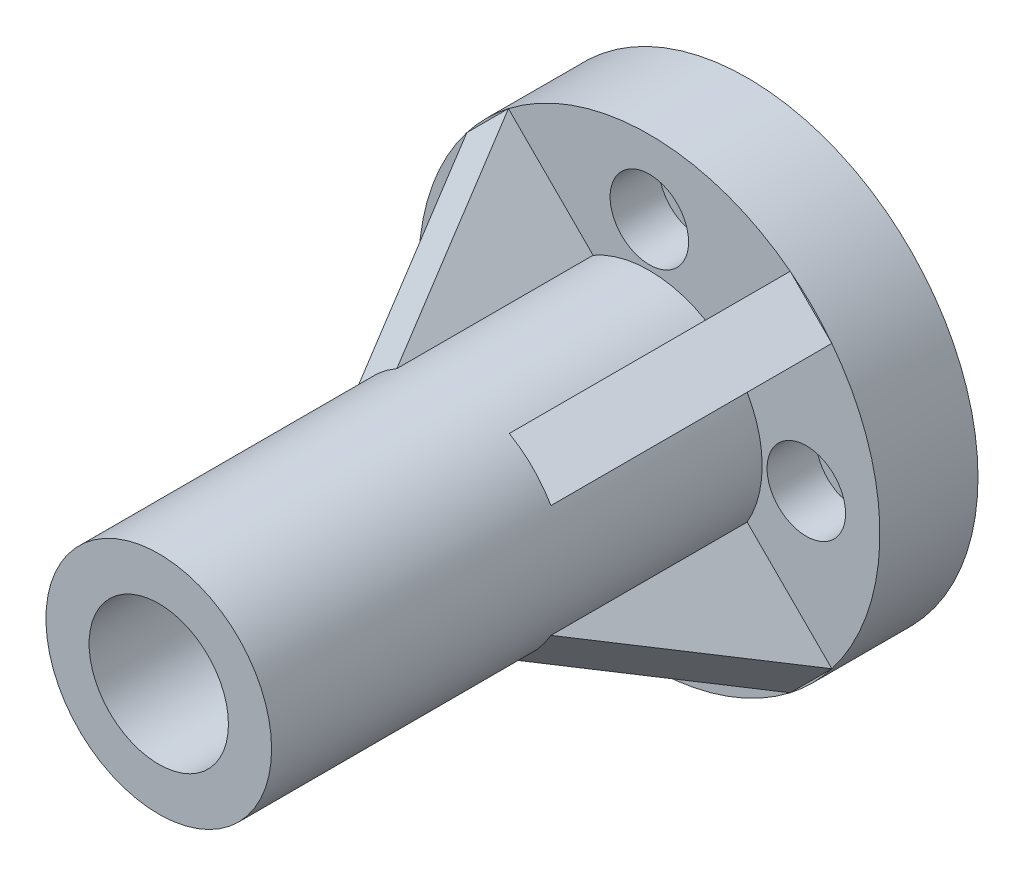
ISO-10303-21;
HEADER;
FILE_DESCRIPTION(('STEP AP214'),'2;1');
FILE_NAME('part.step','',(''),(''),'','','');
FILE_SCHEMA(('AUTOMOTIVE_DESIGN { 1 0 10303 214 1 1 1 1 }'));
ENDSEC;
DATA;
#1=APPLICATION_CONTEXT('core data for automotive mechanical design processes');
#2=APPLICATION_PROTOCOL_DEFINITION('international standard','automotive_design',2000,#1);
#3=PRODUCT_CONTEXT('',#1,'mechanical');
#4=PRODUCT('Part','Part','',(#3));
#5=PRODUCT_RELATED_PRODUCT_CATEGORY('part','',(#4));
#6=PRODUCT_DEFINITION_FORMATION('','',#4);
#7=PRODUCT_DEFINITION_CONTEXT('part definition',#1,'design');
#8=PRODUCT_DEFINITION('design','',#6,#7);
#9=PRODUCT_DEFINITION_SHAPE('','',#8);
#10=(LENGTH_UNIT() NAMED_UNIT(*) SI_UNIT(.MILLI.,.METRE.));
#11=(NAMED_UNIT(*) PLANE_ANGLE_UNIT() SI_UNIT($,.RADIAN.));
#12=(NAMED_UNIT(*) SI_UNIT($,.STERADIAN.) SOLID_ANGLE_UNIT());
#13=UNCERTAINTY_MEASURE_WITH_UNIT(LENGTH_MEASURE(1.E-05),#10,'distance_accuracy_value','');
#14=(GEOMETRIC_REPRESENTATION_CONTEXT(3) GLOBAL_UNCERTAINTY_ASSIGNED_CONTEXT((#13)) GLOBAL_UNIT_ASSIGNED_CONTEXT((#10,
#11,#12)) REPRESENTATION_CONTEXT('',''));
#15=CARTESIAN_POINT('',(0.,0.,0.));
#16=DIRECTION('',(0.,0.,1.));
#17=DIRECTION('',(1.,0.,0.));
#18=AXIS2_PLACEMENT_3D('',#15,#16,#17);
#19=CARTESIAN_POINT('',(0.,0.,5.));
#20=DIRECTION('',(0.,0.,1.));
#21=DIRECTION('',(1.,0.,0.));
#22=AXIS2_PLACEMENT_3D('',#19,#20,#21);
#23=PLANE('',#22);
#24=CARTESIAN_POINT('',(7.99998677689229,0.0145454305034583,5.));
#25=DIRECTION('',(0.,0.,1.));
#26=DIRECTION('',(1.,0.,0.));
#27=AXIS2_PLACEMENT_3D('',#24,#25,#26);
#28=CIRCLE('',#27,2.);
#29=CARTESIAN_POINT('',(9.99998677689229,0.0145454305034583,5.));
#30=VERTEX_POINT('',#29);
#31=EDGE_CURVE('E246',#30,#30,#28,.T.);
#32=ORIENTED_EDGE('',*,*,#31,.F.);
#33=EDGE_LOOP('',(#32));
#34=FACE_BOUND('',#33,.T.);
#35=CARTESIAN_POINT('',(0.,0.,5.));
#36=DIRECTION('',(0.,0.,1.));
#37=DIRECTION('',(1.,0.,0.));
#38=AXIS2_PLACEMENT_3D('',#35,#36,#37);
#39=CIRCLE('',#38,11.75);
#40=CARTESIAN_POINT('',(9.30118503370458,-7.17986469014493,5.));
#41=VERTEX_POINT('',#40);
#42=CARTESIAN_POINT('',(9.3011850337045,7.17986469014503,5.));
#43=VERTEX_POINT('',#42);
#44=EDGE_CURVE('E320',#41,#43,#39,.T.);
#45=ORIENTED_EDGE('',*,*,#44,.T.);
#46=DIRECTION('',(0.70710678118654,0.707106781186555,0.));
#47=VECTOR('',#46,1.);
#48=CARTESIAN_POINT('',(7.34288324568463,5.22156290212512,5.));
#49=LINE('',#48,#47);
#50=CARTESIAN_POINT('',(4.98573978880669,2.86441944524712,5.));
#51=VERTEX_POINT('',#50);
#52=EDGE_CURVE('E65',#51,#43,#49,.T.);
#53=ORIENTED_EDGE('',*,*,#52,.F.);
#54=CARTESIAN_POINT('',(0.,0.,5.));
#55=DIRECTION('',(0.,0.,1.));
#56=DIRECTION('',(1.,0.,0.));
#57=AXIS2_PLACEMENT_3D('',#54,#55,#56);
#58=CIRCLE('',#57,5.75);
#59=CARTESIAN_POINT('',(4.98573978880672,-2.86441944524707,5.));
#60=VERTEX_POINT('',#59);
#61=EDGE_CURVE('E405',#60,#51,#58,.T.);
#62=ORIENTED_EDGE('',*,*,#61,.F.);
#63=DIRECTION('',(-0.707106781186548,0.707106781186547,0.));
#64=VECTOR('',#63,1.);
#65=CARTESIAN_POINT('',(7.34288324568468,-5.22156290212504,5.));
#66=LINE('',#65,#64);
#67=EDGE_CURVE('E341',#41,#60,#66,.T.);
#68=ORIENTED_EDGE('',*,*,#67,.F.);
#69=EDGE_LOOP('',(#45,#53,#62,#68));
#70=FACE_BOUND('',#69,.T.);
#71=ADVANCED_FACE('F41',(#34,#70),#23,.T.);
#72=CARTESIAN_POINT('',(0.,8.,5.));
#73=DIRECTION('',(0.,0.,1.));
#74=DIRECTION('',(1.,0.,0.));
#75=AXIS2_PLACEMENT_3D('',#72,#73,#74);
#76=CIRCLE('',#75,2.);
#77=CARTESIAN_POINT('',(2.,8.,5.));
#78=VERTEX_POINT('',#77);
#79=EDGE_CURVE('E227',#78,#78,#76,.T.);
#80=ORIENTED_EDGE('',*,*,#79,.F.);
#81=EDGE_LOOP('',(#80));
#82=FACE_BOUND('',#81,.T.);
#83=CARTESIAN_POINT('',(2.86441944524702,4.98573978880675,5.));
#84=VERTEX_POINT('',#83);
#85=CARTESIAN_POINT('',(-2.86441944524707,4.98573978880672,5.));
#86=VERTEX_POINT('',#85);
#87=EDGE_CURVE('E218',#84,#86,#58,.T.);
#88=ORIENTED_EDGE('',*,*,#87,.F.);
#89=DIRECTION('',(-0.70710678118654,-0.707106781186555,0.));
#90=VECTOR('',#89,1.);
#91=CARTESIAN_POINT('',(5.22156290212496,7.34288324568474,5.));
#92=LINE('',#91,#90);
#93=CARTESIAN_POINT('',(7.17986469014484,9.30118503370465,5.));
#94=VERTEX_POINT('',#93);
#95=EDGE_CURVE('E394',#94,#84,#92,.T.);
#96=ORIENTED_EDGE('',*,*,#95,.F.);
#97=CARTESIAN_POINT('',(-7.17986469014494,9.30118503370458,5.));
#98=VERTEX_POINT('',#97);
#99=EDGE_CURVE('E301',#94,#98,#39,.T.);
#100=ORIENTED_EDGE('',*,*,#99,.T.);
#101=DIRECTION('',(-0.707106781186548,0.707106781186547,0.));
#102=VECTOR('',#101,1.);
#103=CARTESIAN_POINT('',(-5.22156290212504,7.34288324568468,5.));
#104=LINE('',#103,#102);
#105=EDGE_CURVE('E187',#86,#98,#104,.T.);
#106=ORIENTED_EDGE('',*,*,#105,.F.);
#107=EDGE_LOOP('',(#88,#96,#100,#106));
#108=FACE_BOUND('',#107,.T.);
#109=ADVANCED_FACE('F419',(#82,#108),#23,.T.);
#110=CARTESIAN_POINT('',(0.,0.,20.));
#111=DIRECTION('',(0.,0.,-1.));
#112=DIRECTION('',(-1.,0.,0.));
#113=AXIS2_PLACEMENT_3D('',#110,#111,#112);
#114=CYLINDRICAL_SURFACE('',#113,5.75);
#115=CARTESIAN_POINT('',(0.,0.,30.));
#116=DIRECTION('',(0.,0.,1.));
#117=DIRECTION('',(1.,0.,0.));
#118=AXIS2_PLACEMENT_3D('',#115,#116,#117);
#119=CIRCLE('',#118,5.75);
#120=CARTESIAN_POINT('',(5.75,0.,30.));
#121=VERTEX_POINT('',#120);
#122=EDGE_CURVE('E211',#121,#121,#119,.T.);
#123=ORIENTED_EDGE('',*,*,#122,.F.);
#124=EDGE_LOOP('',(#123));
#125=FACE_BOUND('',#124,.T.);
#126=DIRECTION('',(0.,0.,-1.));
#127=VECTOR('',#126,1.);
#128=CARTESIAN_POINT('',(4.98573978880669,2.86441944524712,15.));
#129=LINE('',#128,#127);
#130=CARTESIAN_POINT('',(4.98573978880669,2.86441944524713,15.));
#131=VERTEX_POINT('',#130);
#132=EDGE_CURVE('E348',#131,#51,#129,.T.);
#133=ORIENTED_EDGE('',*,*,#132,.F.);
#134=CARTESIAN_POINT('',(0.,0.,15.));
#135=DIRECTION('',(0.,0.,-1.));
#136=DIRECTION('',(0.,-1.,0.));
#137=AXIS2_PLACEMENT_3D('',#134,#135,#136);
#138=CIRCLE('',#137,5.75);
#139=CARTESIAN_POINT('',(2.86441944524702,4.98573978880675,15.));
#140=VERTEX_POINT('',#139);
#141=EDGE_CURVE('E391',#140,#131,#138,.T.);
#142=ORIENTED_EDGE('',*,*,#141,.F.);
#143=DIRECTION('',(0.,0.,-1.));
#144=VECTOR('',#143,1.);
#145=CARTESIAN_POINT('',(2.86441944524702,4.98573978880675,15.));
#146=LINE('',#145,#144);
#147=EDGE_CURVE('E57',#140,#84,#146,.T.);
#148=ORIENTED_EDGE('',*,*,#147,.T.);
#149=ORIENTED_EDGE('',*,*,#87,.T.);
#150=DIRECTION('',(0.,0.,-1.));
#151=VECTOR('',#150,1.);
#152=CARTESIAN_POINT('',(-2.86441944524707,4.98573978880672,15.));
#153=LINE('',#152,#151);
#154=CARTESIAN_POINT('',(-2.86441944524707,4.98573978880672,15.));
#155=VERTEX_POINT('',#154);
#156=EDGE_CURVE('E193',#155,#86,#153,.T.);
#157=ORIENTED_EDGE('',*,*,#156,.F.);
#158=CARTESIAN_POINT('',(0.,0.,15.));
#159=DIRECTION('',(0.,0.,-1.));
#160=DIRECTION('',(1.,0.,0.));
#161=AXIS2_PLACEMENT_3D('',#158,#159,#160);
#162=CIRCLE('',#161,5.75);
#163=CARTESIAN_POINT('',(-4.98573978880672,2.86441944524707,15.));
#164=VERTEX_POINT('',#163);
#165=EDGE_CURVE('E190',#164,#155,#162,.T.);
#166=ORIENTED_EDGE('',*,*,#165,.F.);
#167=DIRECTION('',(0.,0.,-1.));
#168=VECTOR('',#167,1.);
#169=CARTESIAN_POINT('',(-4.98573978880672,2.86441944524707,15.));
#170=LINE('',#169,#168);
#171=CARTESIAN_POINT('',(-4.98573978880672,2.86441944524707,5.));
#172=VERTEX_POINT('',#171);
#173=EDGE_CURVE('E203',#164,#172,#170,.T.);
#174=ORIENTED_EDGE('',*,*,#173,.T.);
#175=CARTESIAN_POINT('',(-4.98573978880671,-2.86441944524709,5.));
#176=VERTEX_POINT('',#175);
#177=EDGE_CURVE('E166',#172,#176,#58,.T.);
#178=ORIENTED_EDGE('',*,*,#177,.T.);
#179=DIRECTION('',(0.,0.,-1.));
#180=VECTOR('',#179,1.);
#181=CARTESIAN_POINT('',(-4.98573978880671,-2.86441944524709,15.));
#182=LINE('',#181,#180);
#183=CARTESIAN_POINT('',(-4.98573978880671,-2.86441944524709,15.));
#184=VERTEX_POINT('',#183);
#185=EDGE_CURVE('E141',#184,#176,#182,.T.);
#186=ORIENTED_EDGE('',*,*,#185,.F.);
#187=CARTESIAN_POINT('',(0.,0.,15.));
#188=DIRECTION('',(0.,0.,-1.));
#189=DIRECTION('',(0.,1.,0.));
#190=AXIS2_PLACEMENT_3D('',#187,#188,#189);
#191=CIRCLE('',#190,5.75);
#192=CARTESIAN_POINT('',(-2.86441944524706,-4.98573978880673,15.));
#193=VERTEX_POINT('',#192);
#194=EDGE_CURVE('E133',#193,#184,#191,.T.);
#195=ORIENTED_EDGE('',*,*,#194,.F.);
#196=DIRECTION('',(0.,0.,-1.));
#197=VECTOR('',#196,1.);
#198=CARTESIAN_POINT('',(-2.86441944524706,-4.98573978880673,15.));
#199=LINE('',#198,#197);
#200=CARTESIAN_POINT('',(-2.86441944524706,-4.98573978880673,5.));
#201=VERTEX_POINT('',#200);
#202=EDGE_CURVE('E168',#193,#201,#199,.T.);
#203=ORIENTED_EDGE('',*,*,#202,.T.);
#204=CARTESIAN_POINT('',(2.86441944524707,-4.98573978880672,5.));
#205=VERTEX_POINT('',#204);
#206=EDGE_CURVE('E222',#201,#205,#58,.T.);
#207=ORIENTED_EDGE('',*,*,#206,.T.);
#208=DIRECTION('',(0.,0.,-1.));
#209=VECTOR('',#208,1.);
#210=CARTESIAN_POINT('',(2.86441944524707,-4.98573978880672,15.));
#211=LINE('',#210,#209);
#212=CARTESIAN_POINT('',(2.86441944524707,-4.98573978880672,15.));
#213=VERTEX_POINT('',#212);
#214=EDGE_CURVE('E339',#213,#205,#211,.T.);
#215=ORIENTED_EDGE('',*,*,#214,.F.);
#216=CARTESIAN_POINT('',(0.,0.,15.));
#217=DIRECTION('',(0.,0.,-1.));
#218=DIRECTION('',(-1.,0.,0.));
#219=AXIS2_PLACEMENT_3D('',#216,#217,#218);
#220=CIRCLE('',#219,5.75);
#221=CARTESIAN_POINT('',(4.98573978880672,-2.86441944524707,15.));
#222=VERTEX_POINT('',#221);
#223=EDGE_CURVE('E346',#222,#213,#220,.T.);
#224=ORIENTED_EDGE('',*,*,#223,.F.);
#225=DIRECTION('',(0.,0.,-1.));
#226=VECTOR('',#225,1.);
#227=CARTESIAN_POINT('',(4.98573978880672,-2.86441944524707,15.));
#228=LINE('',#227,#226);
#229=EDGE_CURVE('E354',#222,#60,#228,.T.);
#230=ORIENTED_EDGE('',*,*,#229,.T.);
#231=ORIENTED_EDGE('',*,*,#61,.T.);
#232=EDGE_LOOP('',(#133,#142,#148,#149,#157,#166,#174,#178,#186,#195,#203,#207,#215,#224,#230,#231));
#233=FACE_BOUND('',#232,.T.);
#234=ADVANCED_FACE('F163',(#125,#233),#114,.T.);
#235=CARTESIAN_POINT('',(0.,-8.,5.));
#236=DIRECTION('',(0.,0.,1.));
#237=DIRECTION('',(1.,0.,0.));
#238=AXIS2_PLACEMENT_3D('',#235,#236,#237);
#239=CIRCLE('',#238,2.);
#240=CARTESIAN_POINT('',(2.,-8.,5.));
#241=VERTEX_POINT('',#240);
#242=EDGE_CURVE('E262',#241,#241,#239,.T.);
#243=ORIENTED_EDGE('',*,*,#242,.F.);
#244=EDGE_LOOP('',(#243));
#245=FACE_BOUND('',#244,.T.);
#246=CARTESIAN_POINT('',(-7.1798646901449,-9.3011850337046,5.));
#247=VERTEX_POINT('',#246);
#248=CARTESIAN_POINT('',(7.17986469014494,-9.30118503370458,5.));
#249=VERTEX_POINT('',#248);
#250=EDGE_CURVE('E300',#247,#249,#39,.T.);
#251=ORIENTED_EDGE('',*,*,#250,.T.);
#252=DIRECTION('',(0.707106781186548,-0.707106781186547,0.));
#253=VECTOR('',#252,1.);
#254=CARTESIAN_POINT('',(5.22156290212504,-7.34288324568468,5.));
#255=LINE('',#254,#253);
#256=EDGE_CURVE('E328',#205,#249,#255,.T.);
#257=ORIENTED_EDGE('',*,*,#256,.F.);
#258=ORIENTED_EDGE('',*,*,#206,.F.);
#259=DIRECTION('',(0.707106781186545,0.70710678118655,0.));
#260=VECTOR('',#259,1.);
#261=CARTESIAN_POINT('',(-5.22156290212501,-7.3428832456847,5.));
#262=LINE('',#261,#260);
#263=EDGE_CURVE('E142',#247,#201,#262,.T.);
#264=ORIENTED_EDGE('',*,*,#263,.F.);
#265=EDGE_LOOP('',(#251,#257,#258,#264));
#266=FACE_BOUND('',#265,.T.);
#267=ADVANCED_FACE('F326',(#245,#266),#23,.T.);
#268=CARTESIAN_POINT('',(-8.,0.,5.));
#269=DIRECTION('',(0.,0.,1.));
#270=DIRECTION('',(1.,0.,0.));
#271=AXIS2_PLACEMENT_3D('',#268,#269,#270);
#272=CIRCLE('',#271,2.);
#273=CARTESIAN_POINT('',(-6.,0.,5.));
#274=VERTEX_POINT('',#273);
#275=EDGE_CURVE('E278',#274,#274,#272,.T.);
#276=ORIENTED_EDGE('',*,*,#275,.F.);
#277=EDGE_LOOP('',(#276));
#278=FACE_BOUND('',#277,.T.);
#279=CARTESIAN_POINT('',(-9.30118503370458,7.17986469014493,5.));
#280=VERTEX_POINT('',#279);
#281=CARTESIAN_POINT('',(-9.30118503370455,-7.17986469014497,5.));
#282=VERTEX_POINT('',#281);
#283=EDGE_CURVE('E295',#280,#282,#39,.T.);
#284=ORIENTED_EDGE('',*,*,#283,.T.);
#285=DIRECTION('',(-0.707106781186545,-0.70710678118655,0.));
#286=VECTOR('',#285,1.);
#287=CARTESIAN_POINT('',(-7.34288324568466,-5.22156290212507,5.));
#288=LINE('',#287,#286);
#289=EDGE_CURVE('E158',#176,#282,#288,.T.);
#290=ORIENTED_EDGE('',*,*,#289,.F.);
#291=ORIENTED_EDGE('',*,*,#177,.F.);
#292=DIRECTION('',(0.707106781186548,-0.707106781186547,0.));
#293=VECTOR('',#292,1.);
#294=CARTESIAN_POINT('',(-7.34288324568468,5.22156290212504,5.));
#295=LINE('',#294,#293);
#296=EDGE_CURVE('E194',#280,#172,#295,.T.);
#297=ORIENTED_EDGE('',*,*,#296,.F.);
#298=EDGE_LOOP('',(#284,#290,#291,#297));
#299=FACE_BOUND('',#298,.T.);
#300=ADVANCED_FACE('F434',(#278,#299),#23,.T.);
#301=CARTESIAN_POINT('',(0.,0.,5.));
#302=DIRECTION('',(0.,0.,-1.));
#303=DIRECTION('',(-1.,0.,0.));
#304=AXIS2_PLACEMENT_3D('',#301,#302,#303);
#305=CYLINDRICAL_SURFACE('',#304,11.75);
#306=ORIENTED_EDGE('',*,*,#250,.F.);
#307=CARTESIAN_POINT('',(0.,0.,5.));
#308=DIRECTION('',(0.,0.,-1.));
#309=DIRECTION('',(-1.,0.,0.));
#310=AXIS2_PLACEMENT_3D('',#307,#308,#309);
#311=CIRCLE('',#310,11.75);
#312=EDGE_CURVE('E11',#247,#282,#311,.T.);
#313=ORIENTED_EDGE('',*,*,#312,.T.);
#314=ORIENTED_EDGE('',*,*,#283,.F.);
#315=CARTESIAN_POINT('',(0.,0.,5.));
#316=DIRECTION('',(0.,0.,-1.));
#317=DIRECTION('',(-1.,0.,0.));
#318=AXIS2_PLACEMENT_3D('',#315,#316,#317);
#319=CIRCLE('',#318,11.75);
#320=EDGE_CURVE('E299',#280,#98,#319,.T.);
#321=ORIENTED_EDGE('',*,*,#320,.T.);
#322=ORIENTED_EDGE('',*,*,#99,.F.);
#323=CARTESIAN_POINT('',(0.,0.,5.));
#324=DIRECTION('',(0.,0.,-1.));
#325=DIRECTION('',(-1.,0.,0.));
#326=AXIS2_PLACEMENT_3D('',#323,#324,#325);
#327=CIRCLE('',#326,11.75);
#328=EDGE_CURVE('E308',#94,#43,#327,.T.);
#329=ORIENTED_EDGE('',*,*,#328,.T.);
#330=ORIENTED_EDGE('',*,*,#44,.F.);
#331=CARTESIAN_POINT('',(0.,0.,5.));
#332=DIRECTION('',(0.,0.,-1.));
#333=DIRECTION('',(-1.,0.,0.));
#334=AXIS2_PLACEMENT_3D('',#331,#332,#333);
#335=CIRCLE('',#334,11.75);
#336=EDGE_CURVE('E50',#41,#249,#335,.T.);
#337=ORIENTED_EDGE('',*,*,#336,.T.);
#338=EDGE_LOOP('',(#306,#313,#314,#321,#322,#329,#330,#337));
#339=FACE_BOUND('',#338,.T.);
#340=CARTESIAN_POINT('',(0.,0.,0.));
#341=DIRECTION('',(0.,0.,1.));
#342=DIRECTION('',(1.,0.,0.));
#343=AXIS2_PLACEMENT_3D('',#340,#341,#342);
#344=CIRCLE('',#343,11.75);
#345=CARTESIAN_POINT('',(11.75,0.,0.));
#346=VERTEX_POINT('',#345);
#347=EDGE_CURVE('E294',#346,#346,#344,.T.);
#348=ORIENTED_EDGE('',*,*,#347,.T.);
#349=EDGE_LOOP('',(#348));
#350=FACE_BOUND('',#349,.T.);
#351=ADVANCED_FACE('F43',(#339,#350),#305,.T.);
#352=CARTESIAN_POINT('',(0.,0.,0.));
#353=DIRECTION('',(0.,0.,1.));
#354=DIRECTION('',(1.,0.,0.));
#355=AXIS2_PLACEMENT_3D('',#352,#353,#354);
#356=PLANE('',#355);
#357=CARTESIAN_POINT('',(0.,0.0144734426768406,0.));
#358=DIRECTION('',(0.,0.,-1.));
#359=DIRECTION('',(-1.,0.,0.));
#360=AXIS2_PLACEMENT_3D('',#357,#358,#359);
#361=CIRCLE('',#360,4.25);
#362=CARTESIAN_POINT('',(-4.25,0.0144734426768406,0.));
#363=VERTEX_POINT('',#362);
#364=EDGE_CURVE('E221',#363,#363,#361,.T.);
#365=ORIENTED_EDGE('',*,*,#364,.F.);
#366=EDGE_LOOP('',(#365));
#367=FACE_BOUND('',#366,.T.);
#368=CARTESIAN_POINT('',(0.,8.,0.));
#369=DIRECTION('',(0.,0.,1.));
#370=DIRECTION('',(1.,0.,0.));
#371=AXIS2_PLACEMENT_3D('',#368,#369,#370);
#372=CIRCLE('',#371,0.999999999999999);
#373=CARTESIAN_POINT('',(0.999999999999999,8.,0.));
#374=VERTEX_POINT('',#373);
#375=EDGE_CURVE('E242',#374,#374,#372,.T.);
#376=ORIENTED_EDGE('',*,*,#375,.T.);
#377=EDGE_LOOP('',(#376));
#378=FACE_BOUND('',#377,.T.);
#379=CARTESIAN_POINT('',(7.99998677689229,0.0145454305034583,0.));
#380=DIRECTION('',(0.,0.,1.));
#381=DIRECTION('',(1.,0.,0.));
#382=AXIS2_PLACEMENT_3D('',#379,#380,#381);
#383=CIRCLE('',#382,0.999999999999999);
#384=CARTESIAN_POINT('',(8.99998677689229,0.0145454305034583,0.));
#385=VERTEX_POINT('',#384);
#386=EDGE_CURVE('E258',#385,#385,#383,.T.);
#387=ORIENTED_EDGE('',*,*,#386,.T.);
#388=EDGE_LOOP('',(#387));
#389=FACE_BOUND('',#388,.T.);
#390=CARTESIAN_POINT('',(0.,-8.,0.));
#391=DIRECTION('',(0.,0.,1.));
#392=DIRECTION('',(1.,0.,0.));
#393=AXIS2_PLACEMENT_3D('',#390,#391,#392);
#394=CIRCLE('',#393,0.999999999999999);
#395=CARTESIAN_POINT('',(0.999999999999999,-8.,0.));
#396=VERTEX_POINT('',#395);
#397=EDGE_CURVE('E274',#396,#396,#394,.T.);
#398=ORIENTED_EDGE('',*,*,#397,.T.);
#399=EDGE_LOOP('',(#398));
#400=FACE_BOUND('',#399,.T.);
#401=CARTESIAN_POINT('',(-8.,0.,0.));
#402=DIRECTION('',(0.,0.,1.));
#403=DIRECTION('',(1.,0.,0.));
#404=AXIS2_PLACEMENT_3D('',#401,#402,#403);
#405=CIRCLE('',#404,0.999999999999999);
#406=CARTESIAN_POINT('',(-7.,0.,0.));
#407=VERTEX_POINT('',#406);
#408=EDGE_CURVE('E290',#407,#407,#405,.T.);
#409=ORIENTED_EDGE('',*,*,#408,.T.);
#410=EDGE_LOOP('',(#409));
#411=FACE_BOUND('',#410,.T.);
#412=ORIENTED_EDGE('',*,*,#347,.F.);
#413=EDGE_LOOP('',(#412));
#414=FACE_BOUND('',#413,.T.);
#415=ADVANCED_FACE('F463',(#367,#378,#389,#400,#411,#414),#356,.F.);
#416=CARTESIAN_POINT('',(-8.,0.,5.));
#417=DIRECTION('',(0.,0.,1.));
#418=DIRECTION('',(1.,0.,0.));
#419=AXIS2_PLACEMENT_3D('',#416,#417,#418);
#420=CYLINDRICAL_SURFACE('',#419,1.);
#421=ORIENTED_EDGE('',*,*,#408,.F.);
#422=EDGE_LOOP('',(#421));
#423=FACE_BOUND('',#422,.T.);
#424=CARTESIAN_POINT('',(-8.,0.,2.5));
#425=DIRECTION('',(0.,0.,1.));
#426=DIRECTION('',(1.,0.,0.));
#427=AXIS2_PLACEMENT_3D('',#424,#425,#426);
#428=CIRCLE('',#427,1.);
#429=CARTESIAN_POINT('',(-7.,0.,2.5));
#430=VERTEX_POINT('',#429);
#431=EDGE_CURVE('E286',#430,#430,#428,.T.);
#432=ORIENTED_EDGE('',*,*,#431,.T.);
#433=EDGE_LOOP('',(#432));
#434=FACE_BOUND('',#433,.T.);
#435=ADVANCED_FACE('F480',(#423,#434),#420,.F.);
#436=CARTESIAN_POINT('',(-7.,0.,2.5));
#437=DIRECTION('',(0.,0.,-1.));
#438=DIRECTION('',(-1.,0.,0.));
#439=AXIS2_PLACEMENT_3D('',#436,#437,#438);
#440=PLANE('',#439);
#441=ORIENTED_EDGE('',*,*,#431,.F.);
#442=EDGE_LOOP('',(#441));
#443=FACE_BOUND('',#442,.T.);
#444=CARTESIAN_POINT('',(-8.,0.,2.5));
#445=DIRECTION('',(0.,0.,1.));
#446=DIRECTION('',(1.,0.,0.));
#447=AXIS2_PLACEMENT_3D('',#444,#445,#446);
#448=CIRCLE('',#447,2.);
#449=CARTESIAN_POINT('',(-6.,0.,2.5));
#450=VERTEX_POINT('',#449);
#451=EDGE_CURVE('E282',#450,#450,#448,.T.);
#452=ORIENTED_EDGE('',*,*,#451,.T.);
#453=EDGE_LOOP('',(#452));
#454=FACE_BOUND('',#453,.T.);
#455=ADVANCED_FACE('F470',(#443,#454),#440,.F.);
#456=CARTESIAN_POINT('',(-8.,0.,5.));
#457=DIRECTION('',(0.,0.,1.));
#458=DIRECTION('',(1.,0.,0.));
#459=AXIS2_PLACEMENT_3D('',#456,#457,#458);
#460=CYLINDRICAL_SURFACE('',#459,2.);
#461=ORIENTED_EDGE('',*,*,#451,.F.);
#462=EDGE_LOOP('',(#461));
#463=FACE_BOUND('',#462,.T.);
#464=ORIENTED_EDGE('',*,*,#275,.T.);
#465=EDGE_LOOP('',(#464));
#466=FACE_BOUND('',#465,.T.);
#467=ADVANCED_FACE('F467',(#463,#466),#460,.F.);
#468=CARTESIAN_POINT('',(0.,-8.,5.));
#469=DIRECTION('',(0.,0.,1.));
#470=DIRECTION('',(1.,0.,0.));
#471=AXIS2_PLACEMENT_3D('',#468,#469,#470);
#472=CYLINDRICAL_SURFACE('',#471,0.999999999999999);
#473=ORIENTED_EDGE('',*,*,#397,.F.);
#474=EDGE_LOOP('',(#473));
#475=FACE_BOUND('',#474,.T.);
#476=CARTESIAN_POINT('',(0.,-8.,2.5));
#477=DIRECTION('',(0.,0.,1.));
#478=DIRECTION('',(1.,0.,0.));
#479=AXIS2_PLACEMENT_3D('',#476,#477,#478);
#480=CIRCLE('',#479,1.);
#481=CARTESIAN_POINT('',(1.,-8.,2.5));
#482=VERTEX_POINT('',#481);
#483=EDGE_CURVE('E270',#482,#482,#480,.T.);
#484=ORIENTED_EDGE('',*,*,#483,.T.);
#485=EDGE_LOOP('',(#484));
#486=FACE_BOUND('',#485,.T.);
#487=ADVANCED_FACE('F469',(#475,#486),#472,.F.);
#488=CARTESIAN_POINT('',(1.,-8.,2.5));
#489=DIRECTION('',(0.,0.,-1.));
#490=DIRECTION('',(-1.,0.,0.));
#491=AXIS2_PLACEMENT_3D('',#488,#489,#490);
#492=PLANE('',#491);
#493=ORIENTED_EDGE('',*,*,#483,.F.);
#494=EDGE_LOOP('',(#493));
#495=FACE_BOUND('',#494,.T.);
#496=CARTESIAN_POINT('',(0.,-8.,2.5));
#497=DIRECTION('',(0.,0.,1.));
#498=DIRECTION('',(1.,0.,0.));
#499=AXIS2_PLACEMENT_3D('',#496,#497,#498);
#500=CIRCLE('',#499,2.);
#501=CARTESIAN_POINT('',(2.,-8.,2.5));
#502=VERTEX_POINT('',#501);
#503=EDGE_CURVE('E266',#502,#502,#500,.T.);
#504=ORIENTED_EDGE('',*,*,#503,.T.);
#505=EDGE_LOOP('',(#504));
#506=FACE_BOUND('',#505,.T.);
#507=ADVANCED_FACE('F477',(#495,#506),#492,.F.);
#508=CARTESIAN_POINT('',(0.,-8.,5.));
#509=DIRECTION('',(0.,0.,1.));
#510=DIRECTION('',(1.,0.,0.));
#511=AXIS2_PLACEMENT_3D('',#508,#509,#510);
#512=CYLINDRICAL_SURFACE('',#511,2.);
#513=ORIENTED_EDGE('',*,*,#503,.F.);
#514=EDGE_LOOP('',(#513));
#515=FACE_BOUND('',#514,.T.);
#516=ORIENTED_EDGE('',*,*,#242,.T.);
#517=EDGE_LOOP('',(#516));
#518=FACE_BOUND('',#517,.T.);
#519=ADVANCED_FACE('F512',(#515,#518),#512,.F.);
#520=CARTESIAN_POINT('',(7.99998677689229,0.0145454305034583,5.));
#521=DIRECTION('',(0.,0.,1.));
#522=DIRECTION('',(1.,0.,0.));
#523=AXIS2_PLACEMENT_3D('',#520,#521,#522);
#524=CYLINDRICAL_SURFACE('',#523,0.999999999999999);
#525=ORIENTED_EDGE('',*,*,#386,.F.);
#526=EDGE_LOOP('',(#525));
#527=FACE_BOUND('',#526,.T.);
#528=CARTESIAN_POINT('',(7.99998677689229,0.0145454305034583,2.5));
#529=DIRECTION('',(0.,0.,1.));
#530=DIRECTION('',(1.,0.,0.));
#531=AXIS2_PLACEMENT_3D('',#528,#529,#530);
#532=CIRCLE('',#531,0.999999999999999);
#533=CARTESIAN_POINT('',(8.99998677689229,0.0145454305034583,2.5));
#534=VERTEX_POINT('',#533);
#535=EDGE_CURVE('E254',#534,#534,#532,.T.);
#536=ORIENTED_EDGE('',*,*,#535,.T.);
#537=EDGE_LOOP('',(#536));
#538=FACE_BOUND('',#537,.T.);
#539=ADVANCED_FACE('F517',(#527,#538),#524,.F.);
#540=CARTESIAN_POINT('',(8.99998677689229,0.0145454305034583,2.5));
#541=DIRECTION('',(0.,0.,-1.));
#542=DIRECTION('',(-1.,0.,0.));
#543=AXIS2_PLACEMENT_3D('',#540,#541,#542);
#544=PLANE('',#543);
#545=ORIENTED_EDGE('',*,*,#535,.F.);
#546=EDGE_LOOP('',(#545));
#547=FACE_BOUND('',#546,.T.);
#548=CARTESIAN_POINT('',(7.99998677689229,0.0145454305034583,2.5));
#549=DIRECTION('',(0.,0.,1.));
#550=DIRECTION('',(1.,0.,0.));
#551=AXIS2_PLACEMENT_3D('',#548,#549,#550);
#552=CIRCLE('',#551,2.);
#553=CARTESIAN_POINT('',(9.99998677689229,0.0145454305034583,2.5));
#554=VERTEX_POINT('',#553);
#555=EDGE_CURVE('E250',#554,#554,#552,.T.);
#556=ORIENTED_EDGE('',*,*,#555,.T.);
#557=EDGE_LOOP('',(#556));
#558=FACE_BOUND('',#557,.T.);
#559=ADVANCED_FACE('F523',(#547,#558),#544,.F.);
#560=CARTESIAN_POINT('',(7.99998677689229,0.0145454305034583,5.));
#561=DIRECTION('',(0.,0.,1.));
#562=DIRECTION('',(1.,0.,0.));
#563=AXIS2_PLACEMENT_3D('',#560,#561,#562);
#564=CYLINDRICAL_SURFACE('',#563,2.);
#565=ORIENTED_EDGE('',*,*,#555,.F.);
#566=EDGE_LOOP('',(#565));
#567=FACE_BOUND('',#566,.T.);
#568=ORIENTED_EDGE('',*,*,#31,.T.);
#569=EDGE_LOOP('',(#568));
#570=FACE_BOUND('',#569,.T.);
#571=ADVANCED_FACE('F529',(#567,#570),#564,.F.);
#572=CARTESIAN_POINT('',(0.,8.,5.));
#573=DIRECTION('',(0.,0.,1.));
#574=DIRECTION('',(1.,0.,0.));
#575=AXIS2_PLACEMENT_3D('',#572,#573,#574);
#576=CYLINDRICAL_SURFACE('',#575,0.999999999999999);
#577=ORIENTED_EDGE('',*,*,#375,.F.);
#578=EDGE_LOOP('',(#577));
#579=FACE_BOUND('',#578,.T.);
#580=CARTESIAN_POINT('',(0.,8.,2.5));
#581=DIRECTION('',(0.,0.,1.));
#582=DIRECTION('',(1.,0.,0.));
#583=AXIS2_PLACEMENT_3D('',#580,#581,#582);
#584=CIRCLE('',#583,1.);
#585=CARTESIAN_POINT('',(1.,8.,2.5));
#586=VERTEX_POINT('',#585);
#587=EDGE_CURVE('E238',#586,#586,#584,.T.);
#588=ORIENTED_EDGE('',*,*,#587,.T.);
#589=EDGE_LOOP('',(#588));
#590=FACE_BOUND('',#589,.T.);
#591=ADVANCED_FACE('F533',(#579,#590),#576,.F.);
#592=CARTESIAN_POINT('',(1.,8.,2.5));
#593=DIRECTION('',(0.,0.,-1.));
#594=DIRECTION('',(-1.,0.,0.));
#595=AXIS2_PLACEMENT_3D('',#592,#593,#594);
#596=PLANE('',#595);
#597=ORIENTED_EDGE('',*,*,#587,.F.);
#598=EDGE_LOOP('',(#597));
#599=FACE_BOUND('',#598,.T.);
#600=CARTESIAN_POINT('',(0.,8.,2.5));
#601=DIRECTION('',(0.,0.,1.));
#602=DIRECTION('',(1.,0.,0.));
#603=AXIS2_PLACEMENT_3D('',#600,#601,#602);
#604=CIRCLE('',#603,2.);
#605=CARTESIAN_POINT('',(2.,8.,2.5));
#606=VERTEX_POINT('',#605);
#607=EDGE_CURVE('E234',#606,#606,#604,.T.);
#608=ORIENTED_EDGE('',*,*,#607,.T.);
#609=EDGE_LOOP('',(#608));
#610=FACE_BOUND('',#609,.T.);
#611=ADVANCED_FACE('F537',(#599,#610),#596,.F.);
#612=CARTESIAN_POINT('',(0.,8.,5.));
#613=DIRECTION('',(0.,0.,1.));
#614=DIRECTION('',(1.,0.,0.));
#615=AXIS2_PLACEMENT_3D('',#612,#613,#614);
#616=CYLINDRICAL_SURFACE('',#615,2.);
#617=ORIENTED_EDGE('',*,*,#607,.F.);
#618=EDGE_LOOP('',(#617));
#619=FACE_BOUND('',#618,.T.);
#620=ORIENTED_EDGE('',*,*,#79,.T.);
#621=EDGE_LOOP('',(#620));
#622=FACE_BOUND('',#621,.T.);
#623=ADVANCED_FACE('F541',(#619,#622),#616,.F.);
#624=CARTESIAN_POINT('',(0.,0.0144734426768406,1.9));
#625=DIRECTION('',(0.,0.,-1.));
#626=DIRECTION('',(-1.,0.,0.));
#627=AXIS2_PLACEMENT_3D('',#624,#625,#626);
#628=CYLINDRICAL_SURFACE('',#627,4.25);
#629=CARTESIAN_POINT('',(0.,0.0144734426768406,1.9));
#630=DIRECTION('',(0.,0.,-1.));
#631=DIRECTION('',(-1.,0.,0.));
#632=AXIS2_PLACEMENT_3D('',#629,#630,#631);
#633=CIRCLE('',#632,4.25);
#634=CARTESIAN_POINT('',(-4.25,0.0144734426768406,1.9));
#635=VERTEX_POINT('',#634);
#636=EDGE_CURVE('E223',#635,#635,#633,.T.);
#637=CARTESIAN_POINT('',(-4.25,0.0144734426768406,1.9));
#638=CARTESIAN_POINT('',(-4.25,0.0144734426768406,1.88020833333333));
#639=CARTESIAN_POINT('',(-4.25,0.0144734426768406,1.86041666666667));
#640=CARTESIAN_POINT('',(-4.25,0.0144734426768406,1.82083333333333));
#641=CARTESIAN_POINT('',(-4.25,0.0144734426768406,1.80104166666667));
#642=CARTESIAN_POINT('',(-4.25,0.0144734426768406,1.76145833333333));
#643=CARTESIAN_POINT('',(-4.25,0.0144734426768406,1.74166666666667));
#644=CARTESIAN_POINT('',(-4.25,0.0144734426768406,1.70208333333333));
#645=CARTESIAN_POINT('',(-4.25,0.0144734426768406,1.68229166666667));
#646=CARTESIAN_POINT('',(-4.25,0.0144734426768406,1.64270833333333));
#647=CARTESIAN_POINT('',(-4.25,0.0144734426768406,1.62291666666667));
#648=CARTESIAN_POINT('',(-4.25,0.0144734426768406,1.58333333333333));
#649=CARTESIAN_POINT('',(-4.25,0.0144734426768406,1.56354166666667));
#650=CARTESIAN_POINT('',(-4.25,0.0144734426768406,1.52395833333333));
#651=CARTESIAN_POINT('',(-4.25,0.0144734426768406,1.50416666666667));
#652=CARTESIAN_POINT('',(-4.25,0.0144734426768406,1.46458333333333));
#653=CARTESIAN_POINT('',(-4.25,0.0144734426768406,1.44479166666667));
#654=CARTESIAN_POINT('',(-4.25,0.0144734426768406,1.40520833333333));
#655=CARTESIAN_POINT('',(-4.25,0.0144734426768406,1.38541666666667));
#656=CARTESIAN_POINT('',(-4.25,0.0144734426768406,1.34583333333333));
#657=CARTESIAN_POINT('',(-4.25,0.0144734426768406,1.32604166666667));
#658=CARTESIAN_POINT('',(-4.25,0.0144734426768406,1.28645833333333));
#659=CARTESIAN_POINT('',(-4.25,0.0144734426768406,1.26666666666667));
#660=CARTESIAN_POINT('',(-4.25,0.0144734426768406,1.22708333333333));
#661=CARTESIAN_POINT('',(-4.25,0.0144734426768406,1.20729166666667));
#662=CARTESIAN_POINT('',(-4.25,0.0144734426768406,1.16770833333333));
#663=CARTESIAN_POINT('',(-4.25,0.0144734426768406,1.14791666666667));
#664=CARTESIAN_POINT('',(-4.25,0.0144734426768406,1.10833333333333));
#665=CARTESIAN_POINT('',(-4.25,0.0144734426768406,1.08854166666667));
#666=CARTESIAN_POINT('',(-4.25,0.0144734426768406,1.04895833333333));
#667=CARTESIAN_POINT('',(-4.25,0.0144734426768406,1.02916666666667));
#668=CARTESIAN_POINT('',(-4.25,0.0144734426768406,0.989583333333333));
#669=CARTESIAN_POINT('',(-4.25,0.0144734426768406,0.969791666666667));
#670=CARTESIAN_POINT('',(-4.25,0.0144734426768406,0.930208333333333));
#671=CARTESIAN_POINT('',(-4.25,0.0144734426768406,0.910416666666667));
#672=CARTESIAN_POINT('',(-4.25,0.0144734426768406,0.870833333333333));
#673=CARTESIAN_POINT('',(-4.25,0.0144734426768406,0.851041666666667));
#674=CARTESIAN_POINT('',(-4.25,0.0144734426768406,0.811458333333334));
#675=CARTESIAN_POINT('',(-4.25,0.0144734426768406,0.791666666666667));
#676=CARTESIAN_POINT('',(-4.25,0.0144734426768406,0.752083333333334));
#677=CARTESIAN_POINT('',(-4.25,0.0144734426768406,0.732291666666667));
#678=CARTESIAN_POINT('',(-4.25,0.0144734426768406,0.692708333333333));
#679=CARTESIAN_POINT('',(-4.25,0.0144734426768406,0.672916666666667));
#680=CARTESIAN_POINT('',(-4.25,0.0144734426768406,0.633333333333333));
#681=CARTESIAN_POINT('',(-4.25,0.0144734426768406,0.613541666666667));
#682=CARTESIAN_POINT('',(-4.25,0.0144734426768406,0.573958333333333));
#683=CARTESIAN_POINT('',(-4.25,0.0144734426768406,0.554166666666667));
#684=CARTESIAN_POINT('',(-4.25,0.0144734426768406,0.514583333333334));
#685=CARTESIAN_POINT('',(-4.25,0.0144734426768406,0.494791666666667));
#686=CARTESIAN_POINT('',(-4.25,0.0144734426768406,0.455208333333333));
#687=CARTESIAN_POINT('',(-4.25,0.0144734426768406,0.435416666666667));
#688=CARTESIAN_POINT('',(-4.25,0.0144734426768406,0.395833333333333));
#689=CARTESIAN_POINT('',(-4.25,0.0144734426768406,0.376041666666667));
#690=CARTESIAN_POINT('',(-4.25,0.0144734426768406,0.336458333333333));
#691=CARTESIAN_POINT('',(-4.25,0.0144734426768406,0.316666666666667));
#692=CARTESIAN_POINT('',(-4.25,0.0144734426768406,0.277083333333333));
#693=CARTESIAN_POINT('',(-4.25,0.0144734426768406,0.257291666666667));
#694=CARTESIAN_POINT('',(-4.25,0.0144734426768406,0.217708333333333));
#695=CARTESIAN_POINT('',(-4.25,0.0144734426768406,0.197916666666667));
#696=CARTESIAN_POINT('',(-4.25,0.0144734426768406,0.158333333333333));
#697=CARTESIAN_POINT('',(-4.25,0.0144734426768406,0.138541666666667));
#698=CARTESIAN_POINT('',(-4.25,0.0144734426768406,0.0989583333333333));
#699=CARTESIAN_POINT('',(-4.25,0.0144734426768406,0.0791666666666666));
#700=CARTESIAN_POINT('',(-4.25,0.0144734426768406,0.0395833333333333));
#701=CARTESIAN_POINT('',(-4.25,0.0144734426768406,0.0197916666666666));
#702=CARTESIAN_POINT('',(-4.25,0.0144734426768406,0.));
#703=B_SPLINE_CURVE_WITH_KNOTS('',3,(#637,#638,#639,#640,#641,#642,#643,#644,#645,#646,#647,
#648,#649,#650,#651,#652,#653,#654,#655,#656,#657,#658,#659,#660,#661,#662,#663,#664,#665,#666,
#667,#668,#669,#670,#671,#672,#673,#674,#675,#676,#677,#678,#679,#680,#681,#682,#683,#684,#685,
#686,#687,#688,#689,#690,#691,#692,#693,#694,#695,#696,#697,#698,#699,#700,#701,#702),
.UNSPECIFIED.,.F.,.F.,(4,2,2,2,2,2,2,2,2,2,2,2,2,2,2,2,2,2,2,2,2,2,2,2,2,2,2,2,2,2,2,2,4),(0.,
0.0593750000000002,0.11875,0.178125,0.2375,0.296875,0.35625,0.415625,0.475,0.534375,0.59375,
0.653125,0.7125,0.771875,0.83125,0.890625,0.95,1.009375,1.06875,1.128125,1.1875,1.246875,
1.30625,1.365625,1.425,1.484375,1.54375,1.603125,1.6625,1.721875,1.78125,1.840625,1.9),.UNSPECIFIED.);
#704=EDGE_CURVE('BSEAM545',#635,#363,#703,.T.);
#705=ORIENTED_EDGE('',*,*,#636,.F.);
#706=ORIENTED_EDGE('',*,*,#364,.T.);
#707=ORIENTED_EDGE('',*,*,#704,.T.);
#708=ORIENTED_EDGE('',*,*,#704,.F.);
#709=EDGE_LOOP('',(#705,#707,#706,#708));
#710=FACE_BOUND('',#709,.T.);
#711=ADVANCED_FACE('F545',(#710),#628,.F.);
#712=CARTESIAN_POINT('',(0.,0.0144734426768406,1.9));
#713=DIRECTION('',(0.,0.,-1.));
#714=DIRECTION('',(-1.,0.,0.));
#715=AXIS2_PLACEMENT_3D('',#712,#713,#714);
#716=PLANE('',#715);
#717=ORIENTED_EDGE('',*,*,#636,.T.);
#718=EDGE_LOOP('',(#717));
#719=FACE_BOUND('',#718,.T.);
#720=ADVANCED_FACE('F549',(#719),#716,.T.);
#721=CARTESIAN_POINT('',(0.,0.,30.));
#722=DIRECTION('',(0.,0.,1.));
#723=DIRECTION('',(1.,0.,0.));
#724=AXIS2_PLACEMENT_3D('',#721,#722,#723);
#725=PLANE('',#724);
#726=CARTESIAN_POINT('',(0.,0.,30.));
#727=DIRECTION('',(0.,0.,1.));
#728=DIRECTION('',(1.,0.,0.));
#729=AXIS2_PLACEMENT_3D('',#726,#727,#728);
#730=CIRCLE('',#729,3.55);
#731=CARTESIAN_POINT('',(3.55,0.,30.));
#732=VERTEX_POINT('',#731);
#733=EDGE_CURVE('E206',#732,#732,#730,.T.);
#734=ORIENTED_EDGE('',*,*,#733,.F.);
#735=EDGE_LOOP('',(#734));
#736=FACE_BOUND('',#735,.T.);
#737=ORIENTED_EDGE('',*,*,#122,.T.);
#738=EDGE_LOOP('',(#737));
#739=FACE_BOUND('',#738,.T.);
#740=ADVANCED_FACE('F553',(#736,#739),#725,.T.);
#741=CARTESIAN_POINT('',(0.,0.,10.));
#742=DIRECTION('',(0.,0.,1.));
#743=DIRECTION('',(1.,0.,0.));
#744=AXIS2_PLACEMENT_3D('',#741,#742,#743);
#745=CYLINDRICAL_SURFACE('',#744,3.55);
#746=CARTESIAN_POINT('',(0.,0.,10.));
#747=DIRECTION('',(0.,0.,1.));
#748=DIRECTION('',(1.,0.,0.));
#749=AXIS2_PLACEMENT_3D('',#746,#747,#748);
#750=CIRCLE('',#749,3.55);
#751=CARTESIAN_POINT('',(3.55,0.,10.));
#752=VERTEX_POINT('',#751);
#753=EDGE_CURVE('E207',#752,#752,#750,.T.);
#754=ORIENTED_EDGE('',*,*,#753,.F.);
#755=EDGE_LOOP('',(#754));
#756=FACE_BOUND('',#755,.T.);
#757=ORIENTED_EDGE('',*,*,#733,.T.);
#758=EDGE_LOOP('',(#757));
#759=FACE_BOUND('',#758,.T.);
#760=ADVANCED_FACE('F560',(#756,#759),#745,.F.);
#761=CARTESIAN_POINT('',(0.,0.,10.));
#762=DIRECTION('',(0.,0.,1.));
#763=DIRECTION('',(1.,0.,0.));
#764=AXIS2_PLACEMENT_3D('',#761,#762,#763);
#765=PLANE('',#764);
#766=ORIENTED_EDGE('',*,*,#753,.T.);
#767=EDGE_LOOP('',(#766));
#768=FACE_BOUND('',#767,.T.);
#769=ADVANCED_FACE('F564',(#768),#765,.T.);
#770=CARTESIAN_POINT('',(-5.22156290212504,7.34288324568468,15.));
#771=DIRECTION('',(-0.707106781186547,-0.707106781186548,0.));
#772=DIRECTION('',(0.707106781186548,-0.707106781186547,0.));
#773=AXIS2_PLACEMENT_3D('',#770,#771,#772);
#774=PLANE('',#773);
#775=ORIENTED_EDGE('',*,*,#105,.T.);
#776=DIRECTION('',(0.368362615987121,-0.368362615987121,0.85359121732024));
#777=VECTOR('',#776,1.);
#778=CARTESIAN_POINT('',(-2.86441944524707,4.98573978880672,15.));
#779=LINE('',#778,#777);
#780=EDGE_CURVE('E176',#98,#155,#779,.T.);
#781=ORIENTED_EDGE('',*,*,#780,.T.);
#782=ORIENTED_EDGE('',*,*,#156,.T.);
#783=EDGE_LOOP('',(#775,#781,#782));
#784=FACE_BOUND('',#783,.T.);
#785=ADVANCED_FACE('F417',(#784),#774,.F.);
#786=CARTESIAN_POINT('',(-7.34288324568468,5.22156290212504,15.));
#787=DIRECTION('',(0.707106781186547,0.707106781186548,0.));
#788=DIRECTION('',(-0.707106781186548,0.707106781186547,0.));
#789=AXIS2_PLACEMENT_3D('',#786,#787,#788);
#790=PLANE('',#789);
#791=ORIENTED_EDGE('',*,*,#173,.F.);
#792=DIRECTION('',(0.368362615987121,-0.368362615987121,0.85359121732024));
#793=VECTOR('',#792,1.);
#794=CARTESIAN_POINT('',(-4.98573978880672,2.86441944524707,15.));
#795=LINE('',#794,#793);
#796=EDGE_CURVE('E171',#280,#164,#795,.T.);
#797=ORIENTED_EDGE('',*,*,#796,.F.);
#798=ORIENTED_EDGE('',*,*,#296,.T.);
#799=EDGE_LOOP('',(#791,#797,#798));
#800=FACE_BOUND('',#799,.T.);
#801=ADVANCED_FACE('F437',(#800),#790,.F.);
#802=CARTESIAN_POINT('',(-7.17986469014494,9.30118503370458,5.));
#803=DIRECTION('',(0.,0.,-1.));
#804=DIRECTION('',(-1.,0.,0.));
#805=AXIS2_PLACEMENT_3D('',#802,#803,#804);
#806=PLANE('',#805);
#807=DIRECTION('',(-0.707106781186547,-0.707106781186548,0.));
#808=VECTOR('',#807,1.);
#809=CARTESIAN_POINT('',(-7.17986469014494,9.30118503370458,5.));
#810=LINE('',#809,#808);
#811=EDGE_CURVE('E184',#98,#280,#810,.T.);
#812=ORIENTED_EDGE('',*,*,#811,.F.);
#813=ORIENTED_EDGE('',*,*,#320,.F.);
#814=EDGE_LOOP('',(#812,#813));
#815=FACE_BOUND('',#814,.T.);
#816=ADVANCED_FACE('F425',(#815),#806,.F.);
#817=CARTESIAN_POINT('',(-2.86441944524707,4.98573978880672,15.));
#818=DIRECTION('',(0.,0.,1.));
#819=DIRECTION('',(1.,0.,0.));
#820=AXIS2_PLACEMENT_3D('',#817,#818,#819);
#821=PLANE('',#820);
#822=DIRECTION('',(-0.707106781186547,-0.707106781186548,0.));
#823=VECTOR('',#822,1.);
#824=CARTESIAN_POINT('',(-2.86441944524707,4.98573978880672,15.));
#825=LINE('',#824,#823);
#826=EDGE_CURVE('E180',#155,#164,#825,.T.);
#827=ORIENTED_EDGE('',*,*,#826,.T.);
#828=ORIENTED_EDGE('',*,*,#165,.T.);
#829=EDGE_LOOP('',(#827,#828));
#830=FACE_BOUND('',#829,.T.);
#831=ADVANCED_FACE('F439',(#830),#821,.F.);
#832=CARTESIAN_POINT('',(-2.86441944524707,4.98573978880672,15.));
#833=DIRECTION('',(0.603580138128422,-0.603580138128421,-0.520943407400219));
#834=DIRECTION('',(0.707106781186547,0.707106781186548,0.));
#835=AXIS2_PLACEMENT_3D('',#832,#833,#834);
#836=PLANE('',#835);
#837=ORIENTED_EDGE('',*,*,#796,.T.);
#838=ORIENTED_EDGE('',*,*,#826,.F.);
#839=ORIENTED_EDGE('',*,*,#780,.F.);
#840=ORIENTED_EDGE('',*,*,#811,.T.);
#841=EDGE_LOOP('',(#837,#838,#839,#840));
#842=FACE_BOUND('',#841,.T.);
#843=ADVANCED_FACE('F429',(#842),#836,.F.);
#844=CARTESIAN_POINT('',(-7.34288324568466,-5.22156290212507,15.));
#845=DIRECTION('',(0.70710678118655,-0.707106781186545,0.));
#846=DIRECTION('',(0.707106781186545,0.70710678118655,0.));
#847=AXIS2_PLACEMENT_3D('',#844,#845,#846);
#848=PLANE('',#847);
#849=ORIENTED_EDGE('',*,*,#289,.T.);
#850=DIRECTION('',(0.36836261598712,0.368362615987122,0.85359121732024));
#851=VECTOR('',#850,1.);
#852=CARTESIAN_POINT('',(-4.98573978880671,-2.86441944524709,15.));
#853=LINE('',#852,#851);
#854=EDGE_CURVE('E148',#282,#184,#853,.T.);
#855=ORIENTED_EDGE('',*,*,#854,.T.);
#856=ORIENTED_EDGE('',*,*,#185,.T.);
#857=EDGE_LOOP('',(#849,#855,#856));
#858=FACE_BOUND('',#857,.T.);
#859=ADVANCED_FACE('F157',(#858),#848,.F.);
#860=CARTESIAN_POINT('',(-5.22156290212501,-7.3428832456847,15.));
#861=DIRECTION('',(-0.70710678118655,0.707106781186545,0.));
#862=DIRECTION('',(-0.707106781186545,-0.70710678118655,0.));
#863=AXIS2_PLACEMENT_3D('',#860,#861,#862);
#864=PLANE('',#863);
#865=ORIENTED_EDGE('',*,*,#202,.F.);
#866=DIRECTION('',(0.36836261598712,0.368362615987122,0.85359121732024));
#867=VECTOR('',#866,1.);
#868=CARTESIAN_POINT('',(-2.86441944524706,-4.98573978880673,15.));
#869=LINE('',#868,#867);
#870=EDGE_CURVE('E150',#247,#193,#869,.T.);
#871=ORIENTED_EDGE('',*,*,#870,.F.);
#872=ORIENTED_EDGE('',*,*,#263,.T.);
#873=EDGE_LOOP('',(#865,#871,#872));
#874=FACE_BOUND('',#873,.T.);
#875=ADVANCED_FACE('F359',(#874),#864,.F.);
#876=CARTESIAN_POINT('',(5.22156290212504,-7.34288324568468,15.));
#877=DIRECTION('',(0.707106781186547,0.707106781186548,0.));
#878=DIRECTION('',(-0.707106781186548,0.707106781186547,0.));
#879=AXIS2_PLACEMENT_3D('',#876,#877,#878);
#880=PLANE('',#879);
#881=ORIENTED_EDGE('',*,*,#256,.T.);
#882=DIRECTION('',(-0.368362615987121,0.368362615987121,0.85359121732024));
#883=VECTOR('',#882,1.);
#884=CARTESIAN_POINT('',(2.86441944524707,-4.98573978880672,15.));
#885=LINE('',#884,#883);
#886=EDGE_CURVE('E337',#249,#213,#885,.T.);
#887=ORIENTED_EDGE('',*,*,#886,.T.);
#888=ORIENTED_EDGE('',*,*,#214,.T.);
#889=EDGE_LOOP('',(#881,#887,#888));
#890=FACE_BOUND('',#889,.T.);
#891=ADVANCED_FACE('F335',(#890),#880,.F.);
#892=CARTESIAN_POINT('',(7.34288324568468,-5.22156290212504,15.));
#893=DIRECTION('',(-0.707106781186547,-0.707106781186548,0.));
#894=DIRECTION('',(0.707106781186548,-0.707106781186547,0.));
#895=AXIS2_PLACEMENT_3D('',#892,#893,#894);
#896=PLANE('',#895);
#897=ORIENTED_EDGE('',*,*,#229,.F.);
#898=DIRECTION('',(-0.368362615987121,0.368362615987121,0.85359121732024));
#899=VECTOR('',#898,1.);
#900=CARTESIAN_POINT('',(4.98573978880672,-2.86441944524707,15.));
#901=LINE('',#900,#899);
#902=EDGE_CURVE('E371',#41,#222,#901,.T.);
#903=ORIENTED_EDGE('',*,*,#902,.F.);
#904=ORIENTED_EDGE('',*,*,#67,.T.);
#905=EDGE_LOOP('',(#897,#903,#904));
#906=FACE_BOUND('',#905,.T.);
#907=ADVANCED_FACE('F653',(#906),#896,.F.);
#908=CARTESIAN_POINT('',(7.34288324568463,5.22156290212512,15.));
#909=DIRECTION('',(-0.707106781186555,0.70710678118654,0.));
#910=DIRECTION('',(-0.70710678118654,-0.707106781186555,0.));
#911=AXIS2_PLACEMENT_3D('',#908,#909,#910);
#912=PLANE('',#911);
#913=ORIENTED_EDGE('',*,*,#52,.T.);
#914=DIRECTION('',(-0.368362615987117,-0.368362615987125,0.85359121732024));
#915=VECTOR('',#914,1.);
#916=CARTESIAN_POINT('',(4.98573978880669,2.86441944524713,15.));
#917=LINE('',#916,#915);
#918=EDGE_CURVE('E378',#43,#131,#917,.T.);
#919=ORIENTED_EDGE('',*,*,#918,.T.);
#920=ORIENTED_EDGE('',*,*,#132,.T.);
#921=EDGE_LOOP('',(#913,#919,#920));
#922=FACE_BOUND('',#921,.T.);
#923=ADVANCED_FACE('F403',(#922),#912,.F.);
#924=CARTESIAN_POINT('',(5.22156290212496,7.34288324568474,15.));
#925=DIRECTION('',(0.707106781186555,-0.70710678118654,0.));
#926=DIRECTION('',(0.70710678118654,0.707106781186555,0.));
#927=AXIS2_PLACEMENT_3D('',#924,#925,#926);
#928=PLANE('',#927);
#929=ORIENTED_EDGE('',*,*,#147,.F.);
#930=DIRECTION('',(-0.368362615987117,-0.368362615987125,0.85359121732024));
#931=VECTOR('',#930,1.);
#932=CARTESIAN_POINT('',(2.86441944524702,4.98573978880675,15.));
#933=LINE('',#932,#931);
#934=EDGE_CURVE('E383',#94,#140,#933,.T.);
#935=ORIENTED_EDGE('',*,*,#934,.F.);
#936=ORIENTED_EDGE('',*,*,#95,.T.);
#937=EDGE_LOOP('',(#929,#935,#936));
#938=FACE_BOUND('',#937,.T.);
#939=ADVANCED_FACE('F673',(#938),#928,.F.);
#940=CARTESIAN_POINT('',(9.3011850337045,7.17986469014503,5.));
#941=DIRECTION('',(0.,0.,-1.));
#942=DIRECTION('',(-1.,0.,0.));
#943=AXIS2_PLACEMENT_3D('',#940,#941,#942);
#944=PLANE('',#943);
#945=DIRECTION('',(-0.707106781186555,0.70710678118654,0.));
#946=VECTOR('',#945,1.);
#947=CARTESIAN_POINT('',(9.3011850337045,7.17986469014503,5.));
#948=LINE('',#947,#946);
#949=EDGE_CURVE('E374',#43,#94,#948,.T.);
#950=ORIENTED_EDGE('',*,*,#949,.F.);
#951=ORIENTED_EDGE('',*,*,#328,.F.);
#952=EDGE_LOOP('',(#950,#951));
#953=FACE_BOUND('',#952,.T.);
#954=ADVANCED_FACE('F683',(#953),#944,.F.);
#955=CARTESIAN_POINT('',(4.98573978880669,2.86441944524713,15.));
#956=DIRECTION('',(0.,0.,1.));
#957=DIRECTION('',(1.,0.,0.));
#958=AXIS2_PLACEMENT_3D('',#955,#956,#957);
#959=PLANE('',#958);
#960=DIRECTION('',(-0.707106781186555,0.70710678118654,0.));
#961=VECTOR('',#960,1.);
#962=CARTESIAN_POINT('',(4.98573978880669,2.86441944524713,15.));
#963=LINE('',#962,#961);
#964=EDGE_CURVE('E382',#131,#140,#963,.T.);
#965=ORIENTED_EDGE('',*,*,#964,.T.);
#966=ORIENTED_EDGE('',*,*,#141,.T.);
#967=EDGE_LOOP('',(#965,#966));
#968=FACE_BOUND('',#967,.T.);
#969=ADVANCED_FACE('F693',(#968),#959,.F.);
#970=CARTESIAN_POINT('',(4.98573978880669,2.86441944524713,15.));
#971=DIRECTION('',(-0.603580138128415,-0.603580138128428,-0.520943407400219));
#972=DIRECTION('',(0.707106781186555,-0.70710678118654,0.));
#973=AXIS2_PLACEMENT_3D('',#970,#971,#972);
#974=PLANE('',#973);
#975=ORIENTED_EDGE('',*,*,#934,.T.);
#976=ORIENTED_EDGE('',*,*,#964,.F.);
#977=ORIENTED_EDGE('',*,*,#918,.F.);
#978=ORIENTED_EDGE('',*,*,#949,.T.);
#979=EDGE_LOOP('',(#975,#976,#977,#978));
#980=FACE_BOUND('',#979,.T.);
#981=ADVANCED_FACE('F703',(#980),#974,.F.);
#982=CARTESIAN_POINT('',(7.17986469014494,-9.30118503370458,5.));
#983=DIRECTION('',(0.,0.,-1.));
#984=DIRECTION('',(-1.,0.,0.));
#985=AXIS2_PLACEMENT_3D('',#982,#983,#984);
#986=PLANE('',#985);
#987=DIRECTION('',(0.707106781186547,0.707106781186548,0.));
#988=VECTOR('',#987,1.);
#989=CARTESIAN_POINT('',(7.17986469014494,-9.30118503370458,5.));
#990=LINE('',#989,#988);
#991=EDGE_CURVE('E361',#249,#41,#990,.T.);
#992=ORIENTED_EDGE('',*,*,#991,.F.);
#993=ORIENTED_EDGE('',*,*,#336,.F.);
#994=EDGE_LOOP('',(#992,#993));
#995=FACE_BOUND('',#994,.T.);
#996=ADVANCED_FACE('F713',(#995),#986,.F.);
#997=CARTESIAN_POINT('',(2.86441944524707,-4.98573978880672,15.));
#998=DIRECTION('',(0.,0.,1.));
#999=DIRECTION('',(1.,0.,0.));
#1000=AXIS2_PLACEMENT_3D('',#997,#998,#999);
#1001=PLANE('',#1000);
#1002=DIRECTION('',(0.707106781186547,0.707106781186548,0.));
#1003=VECTOR('',#1002,1.);
#1004=CARTESIAN_POINT('',(2.86441944524707,-4.98573978880672,15.));
#1005=LINE('',#1004,#1003);
#1006=EDGE_CURVE('E364',#213,#222,#1005,.T.);
#1007=ORIENTED_EDGE('',*,*,#1006,.T.);
#1008=ORIENTED_EDGE('',*,*,#223,.T.);
#1009=EDGE_LOOP('',(#1007,#1008));
#1010=FACE_BOUND('',#1009,.T.);
#1011=ADVANCED_FACE('F723',(#1010),#1001,.F.);
#1012=CARTESIAN_POINT('',(2.86441944524707,-4.98573978880672,15.));
#1013=DIRECTION('',(-0.603580138128422,0.603580138128421,-0.520943407400219));
#1014=DIRECTION('',(-0.707106781186547,-0.707106781186548,0.));
#1015=AXIS2_PLACEMENT_3D('',#1012,#1013,#1014);
#1016=PLANE('',#1015);
#1017=ORIENTED_EDGE('',*,*,#902,.T.);
#1018=ORIENTED_EDGE('',*,*,#1006,.F.);
#1019=ORIENTED_EDGE('',*,*,#886,.F.);
#1020=ORIENTED_EDGE('',*,*,#991,.T.);
#1021=EDGE_LOOP('',(#1017,#1018,#1019,#1020));
#1022=FACE_BOUND('',#1021,.T.);
#1023=ADVANCED_FACE('F732',(#1022),#1016,.F.);
#1024=CARTESIAN_POINT('',(-9.30118503370455,-7.17986469014497,5.));
#1025=DIRECTION('',(0.,0.,-1.));
#1026=DIRECTION('',(-1.,0.,0.));
#1027=AXIS2_PLACEMENT_3D('',#1024,#1025,#1026);
#1028=PLANE('',#1027);
#1029=DIRECTION('',(0.70710678118655,-0.707106781186545,0.));
#1030=VECTOR('',#1029,1.);
#1031=CARTESIAN_POINT('',(-9.30118503370455,-7.17986469014497,5.));
#1032=LINE('',#1031,#1030);
#1033=EDGE_CURVE('E152',#282,#247,#1032,.T.);
#1034=ORIENTED_EDGE('',*,*,#1033,.F.);
#1035=ORIENTED_EDGE('',*,*,#312,.F.);
#1036=EDGE_LOOP('',(#1034,#1035));
#1037=FACE_BOUND('',#1036,.T.);
#1038=ADVANCED_FACE('F742',(#1037),#1028,.F.);
#1039=CARTESIAN_POINT('',(-4.98573978880671,-2.86441944524709,15.));
#1040=DIRECTION('',(0.,0.,1.));
#1041=DIRECTION('',(1.,0.,0.));
#1042=AXIS2_PLACEMENT_3D('',#1039,#1040,#1041);
#1043=PLANE('',#1042);
#1044=DIRECTION('',(0.70710678118655,-0.707106781186545,0.));
#1045=VECTOR('',#1044,1.);
#1046=CARTESIAN_POINT('',(-4.98573978880671,-2.86441944524709,15.));
#1047=LINE('',#1046,#1045);
#1048=EDGE_CURVE('E136',#184,#193,#1047,.T.);
#1049=ORIENTED_EDGE('',*,*,#1048,.T.);
#1050=ORIENTED_EDGE('',*,*,#194,.T.);
#1051=EDGE_LOOP('',(#1049,#1050));
#1052=FACE_BOUND('',#1051,.T.);
#1053=ADVANCED_FACE('F135',(#1052),#1043,.F.);
#1054=CARTESIAN_POINT('',(-4.98573978880671,-2.86441944524709,15.));
#1055=DIRECTION('',(0.60358013812842,0.603580138128424,-0.520943407400219));
#1056=DIRECTION('',(-0.70710678118655,0.707106781186545,0.));
#1057=AXIS2_PLACEMENT_3D('',#1054,#1055,#1056);
#1058=PLANE('',#1057);
#1059=ORIENTED_EDGE('',*,*,#870,.T.);
#1060=ORIENTED_EDGE('',*,*,#1048,.F.);
#1061=ORIENTED_EDGE('',*,*,#854,.F.);
#1062=ORIENTED_EDGE('',*,*,#1033,.T.);
#1063=EDGE_LOOP('',(#1059,#1060,#1061,#1062));
#1064=FACE_BOUND('',#1063,.T.);
#1065=ADVANCED_FACE('F147',(#1064),#1058,.F.);
#1066=CLOSED_SHELL('',(#71,#109,#234,#267,#300,#351,#415,#435,#455,#467,#487,#507,#519,#539,
#559,#571,#591,#611,#623,#711,#720,#740,#760,#769,#785,#801,#816,#831,#843,#859,#875,#891,#907,
#923,#939,#954,#969,#981,#996,#1011,#1023,#1038,#1053,#1065));
#1067=MANIFOLD_SOLID_BREP('B2',#1066);
#1068=ADVANCED_BREP_SHAPE_REPRESENTATION('',(#18,#1067),#14);
#1069=SHAPE_DEFINITION_REPRESENTATION(#9,#1068);
ENDSEC;
END-ISO-10303-21;
